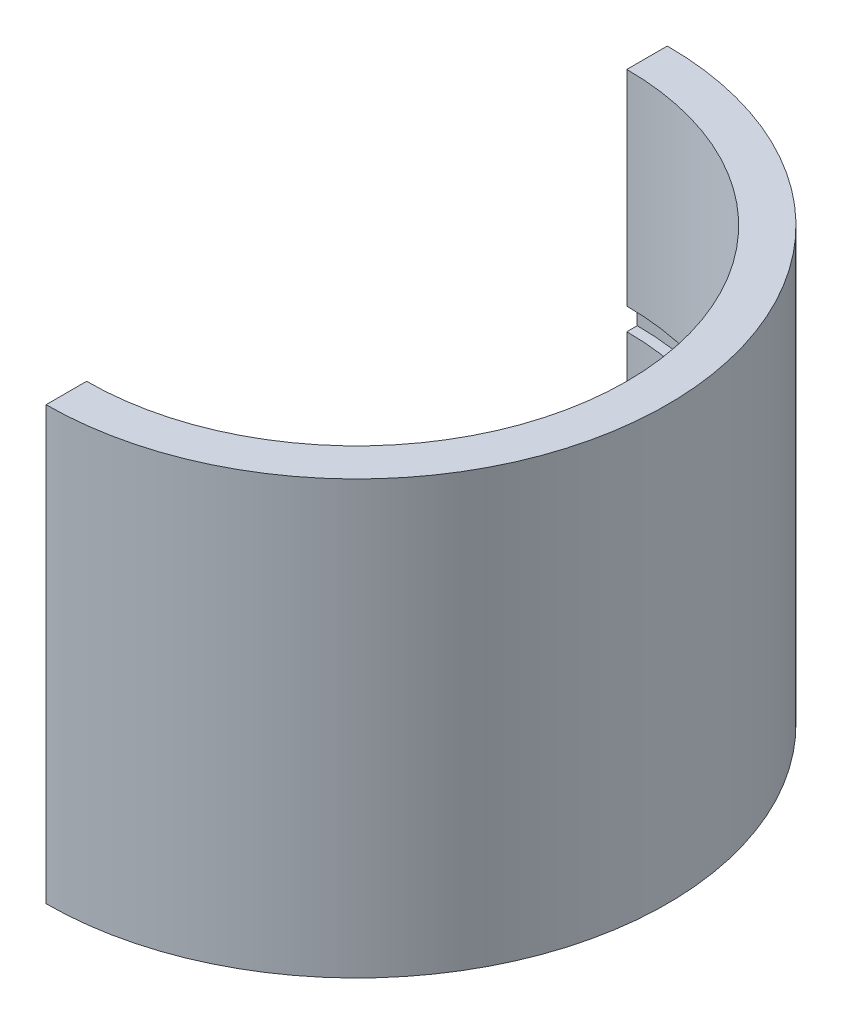
ISO-10303-21;
HEADER;
FILE_DESCRIPTION(('STEP AP214'),'2;1');
FILE_NAME('part.step','',(''),(''),'','','');
FILE_SCHEMA(('AUTOMOTIVE_DESIGN { 1 0 10303 214 1 1 1 1 }'));
ENDSEC;
DATA;
#1=APPLICATION_CONTEXT('core data for automotive mechanical design processes');
#2=APPLICATION_PROTOCOL_DEFINITION('international standard','automotive_design',2000,#1);
#3=PRODUCT_CONTEXT('',#1,'mechanical');
#4=PRODUCT('Part','Part','',(#3));
#5=PRODUCT_RELATED_PRODUCT_CATEGORY('part','',(#4));
#6=PRODUCT_DEFINITION_FORMATION('','',#4);
#7=PRODUCT_DEFINITION_CONTEXT('part definition',#1,'design');
#8=PRODUCT_DEFINITION('design','',#6,#7);
#9=PRODUCT_DEFINITION_SHAPE('','',#8);
#10=(LENGTH_UNIT() NAMED_UNIT(*) SI_UNIT(.MILLI.,.METRE.));
#11=(NAMED_UNIT(*) PLANE_ANGLE_UNIT() SI_UNIT($,.RADIAN.));
#12=(NAMED_UNIT(*) SI_UNIT($,.STERADIAN.) SOLID_ANGLE_UNIT());
#13=UNCERTAINTY_MEASURE_WITH_UNIT(LENGTH_MEASURE(1.E-05),#10,'distance_accuracy_value','');
#14=(GEOMETRIC_REPRESENTATION_CONTEXT(3) GLOBAL_UNCERTAINTY_ASSIGNED_CONTEXT((#13)) GLOBAL_UNIT_ASSIGNED_CONTEXT((#10,
#11,#12)) REPRESENTATION_CONTEXT('',''));
#15=CARTESIAN_POINT('',(0.,0.,0.));
#16=DIRECTION('',(0.,0.,1.));
#17=DIRECTION('',(1.,0.,0.));
#18=AXIS2_PLACEMENT_3D('',#15,#16,#17);
#19=CARTESIAN_POINT('',(0.,19.,0.));
#20=DIRECTION('',(-1.,0.,0.));
#21=DIRECTION('',(0.,0.,1.));
#22=AXIS2_PLACEMENT_3D('',#19,#20,#21);
#23=PLANE('',#22);
#24=DIRECTION('',(0.,-1.,0.));
#25=VECTOR('',#24,1.);
#26=CARTESIAN_POINT('',(0.,19.,11.5));
#27=LINE('',#26,#25);
#28=CARTESIAN_POINT('',(0.,17.5,11.5));
#29=VERTEX_POINT('',#28);
#30=CARTESIAN_POINT('',(0.,1.5,11.5));
#31=VERTEX_POINT('',#30);
#32=EDGE_CURVE('E124',#29,#31,#27,.T.);
#33=ORIENTED_EDGE('',*,*,#32,.F.);
#34=DIRECTION('',(0.,0.,1.));
#35=VECTOR('',#34,1.);
#36=CARTESIAN_POINT('',(0.,17.5,10.));
#37=LINE('',#36,#35);
#38=CARTESIAN_POINT('',(0.,17.5,10.));
#39=VERTEX_POINT('',#38);
#40=EDGE_CURVE('E113',#39,#29,#37,.T.);
#41=ORIENTED_EDGE('',*,*,#40,.F.);
#42=DIRECTION('',(0.,-1.,0.));
#43=VECTOR('',#42,1.);
#44=CARTESIAN_POINT('',(0.,19.,10.));
#45=LINE('',#44,#43);
#46=CARTESIAN_POINT('',(0.,9.90994728555532,10.));
#47=VERTEX_POINT('',#46);
#48=EDGE_CURVE('E48',#39,#47,#45,.T.);
#49=ORIENTED_EDGE('',*,*,#48,.T.);
#50=DIRECTION('',(0.,0.,1.));
#51=VECTOR('',#50,1.);
#52=CARTESIAN_POINT('',(0.,9.90994728555532,0.));
#53=LINE('',#52,#51);
#54=CARTESIAN_POINT('',(0.,9.90994728555532,10.385));
#55=VERTEX_POINT('',#54);
#56=EDGE_CURVE('E133',#47,#55,#53,.T.);
#57=ORIENTED_EDGE('',*,*,#56,.T.);
#58=DIRECTION('',(0.,-1.,0.));
#59=VECTOR('',#58,1.);
#60=CARTESIAN_POINT('',(0.,-0.799894571110644,10.385));
#61=LINE('',#60,#59);
#62=CARTESIAN_POINT('',(0.,9.09005271444468,10.385));
#63=VERTEX_POINT('',#62);
#64=EDGE_CURVE('E156',#63,#55,#61,.F.);
#65=ORIENTED_EDGE('',*,*,#64,.F.);
#66=DIRECTION('',(0.,0.,1.));
#67=VECTOR('',#66,1.);
#68=CARTESIAN_POINT('',(0.,9.09005271444468,0.));
#69=LINE('',#68,#67);
#70=CARTESIAN_POINT('',(0.,9.09005271444468,10.));
#71=VERTEX_POINT('',#70);
#72=EDGE_CURVE('E160',#71,#63,#69,.T.);
#73=ORIENTED_EDGE('',*,*,#72,.F.);
#74=CARTESIAN_POINT('',(0.,1.5,10.));
#75=VERTEX_POINT('',#74);
#76=EDGE_CURVE('E134',#71,#75,#45,.T.);
#77=ORIENTED_EDGE('',*,*,#76,.T.);
#78=DIRECTION('',(0.,0.,-1.));
#79=VECTOR('',#78,1.);
#80=CARTESIAN_POINT('',(0.,1.5,11.5));
#81=LINE('',#80,#79);
#82=EDGE_CURVE('E70',#31,#75,#81,.T.);
#83=ORIENTED_EDGE('',*,*,#82,.F.);
#84=EDGE_LOOP('',(#33,#41,#49,#57,#65,#73,#77,#83));
#85=FACE_BOUND('',#84,.T.);
#86=ADVANCED_FACE('F45',(#85),#23,.T.);
#87=CARTESIAN_POINT('',(0.,19.,0.));
#88=DIRECTION('',(0.,-1.,0.));
#89=DIRECTION('',(0.,0.,-1.));
#90=AXIS2_PLACEMENT_3D('',#87,#88,#89);
#91=CYLINDRICAL_SURFACE('',#90,11.5);
#92=CARTESIAN_POINT('',(0.,17.5,0.));
#93=DIRECTION('',(0.,1.,0.));
#94=DIRECTION('',(0.,0.,1.));
#95=AXIS2_PLACEMENT_3D('',#92,#93,#94);
#96=CIRCLE('',#95,11.5);
#97=CARTESIAN_POINT('',(0.,17.5,-11.5));
#98=VERTEX_POINT('',#97);
#99=EDGE_CURVE('E126',#29,#98,#96,.T.);
#100=ORIENTED_EDGE('',*,*,#99,.F.);
#101=ORIENTED_EDGE('',*,*,#32,.T.);
#102=CARTESIAN_POINT('',(0.,1.5,0.));
#103=DIRECTION('',(0.,-1.,0.));
#104=DIRECTION('',(0.,0.,-1.));
#105=AXIS2_PLACEMENT_3D('',#102,#103,#104);
#106=CIRCLE('',#105,11.5);
#107=CARTESIAN_POINT('',(0.,1.5,-11.5));
#108=VERTEX_POINT('',#107);
#109=EDGE_CURVE('E187',#108,#31,#106,.T.);
#110=ORIENTED_EDGE('',*,*,#109,.F.);
#111=DIRECTION('',(0.,-1.,0.));
#112=VECTOR('',#111,1.);
#113=CARTESIAN_POINT('',(0.,19.,-11.5));
#114=LINE('',#113,#112);
#115=EDGE_CURVE('E153',#98,#108,#114,.T.);
#116=ORIENTED_EDGE('',*,*,#115,.F.);
#117=EDGE_LOOP('',(#100,#101,#110,#116));
#118=FACE_BOUND('',#117,.T.);
#119=ADVANCED_FACE('F199',(#118),#91,.T.);
#120=DIRECTION('',(0.,-1.,0.));
#121=VECTOR('',#120,1.);
#122=CARTESIAN_POINT('',(0.,19.,-10.));
#123=LINE('',#122,#121);
#124=CARTESIAN_POINT('',(0.,17.5,-10.));
#125=VERTEX_POINT('',#124);
#126=CARTESIAN_POINT('',(0.,9.90994728555532,-10.));
#127=VERTEX_POINT('',#126);
#128=EDGE_CURVE('E142',#125,#127,#123,.T.);
#129=ORIENTED_EDGE('',*,*,#128,.F.);
#130=DIRECTION('',(0.,0.,1.));
#131=VECTOR('',#130,1.);
#132=CARTESIAN_POINT('',(0.,17.5,-11.5));
#133=LINE('',#132,#131);
#134=EDGE_CURVE('E62',#98,#125,#133,.T.);
#135=ORIENTED_EDGE('',*,*,#134,.F.);
#136=ORIENTED_EDGE('',*,*,#115,.T.);
#137=DIRECTION('',(0.,0.,-1.));
#138=VECTOR('',#137,1.);
#139=CARTESIAN_POINT('',(0.,1.5,-10.));
#140=LINE('',#139,#138);
#141=CARTESIAN_POINT('',(0.,1.5,-10.));
#142=VERTEX_POINT('',#141);
#143=EDGE_CURVE('E145',#142,#108,#140,.T.);
#144=ORIENTED_EDGE('',*,*,#143,.F.);
#145=CARTESIAN_POINT('',(0.,9.09005271444468,-10.));
#146=VERTEX_POINT('',#145);
#147=EDGE_CURVE('E146',#146,#142,#123,.T.);
#148=ORIENTED_EDGE('',*,*,#147,.F.);
#149=DIRECTION('',(0.,0.,1.));
#150=VECTOR('',#149,1.);
#151=CARTESIAN_POINT('',(0.,9.09005271444468,0.));
#152=LINE('',#151,#150);
#153=CARTESIAN_POINT('',(0.,9.09005271444468,-10.385));
#154=VERTEX_POINT('',#153);
#155=EDGE_CURVE('E163',#154,#146,#152,.T.);
#156=ORIENTED_EDGE('',*,*,#155,.F.);
#157=DIRECTION('',(0.,-1.,0.));
#158=VECTOR('',#157,1.);
#159=CARTESIAN_POINT('',(0.,-0.799894571110644,-10.385));
#160=LINE('',#159,#158);
#161=CARTESIAN_POINT('',(0.,9.90994728555532,-10.385));
#162=VERTEX_POINT('',#161);
#163=EDGE_CURVE('E159',#162,#154,#160,.T.);
#164=ORIENTED_EDGE('',*,*,#163,.F.);
#165=DIRECTION('',(0.,0.,1.));
#166=VECTOR('',#165,1.);
#167=CARTESIAN_POINT('',(0.,9.90994728555532,0.));
#168=LINE('',#167,#166);
#169=EDGE_CURVE('E152',#162,#127,#168,.T.);
#170=ORIENTED_EDGE('',*,*,#169,.T.);
#171=EDGE_LOOP('',(#129,#135,#136,#144,#148,#156,#164,#170));
#172=FACE_BOUND('',#171,.T.);
#173=ADVANCED_FACE('F196',(#172),#23,.T.);
#174=CARTESIAN_POINT('',(0.,19.,0.));
#175=DIRECTION('',(0.,-1.,0.));
#176=DIRECTION('',(0.,0.,-1.));
#177=AXIS2_PLACEMENT_3D('',#174,#175,#176);
#178=CYLINDRICAL_SURFACE('',#177,10.);
#179=ORIENTED_EDGE('',*,*,#48,.F.);
#180=CARTESIAN_POINT('',(0.,17.5,0.));
#181=DIRECTION('',(0.,-1.,0.));
#182=DIRECTION('',(0.,0.,1.));
#183=AXIS2_PLACEMENT_3D('',#180,#181,#182);
#184=CIRCLE('',#183,10.);
#185=EDGE_CURVE('E110',#125,#39,#184,.T.);
#186=ORIENTED_EDGE('',*,*,#185,.F.);
#187=ORIENTED_EDGE('',*,*,#128,.T.);
#188=CARTESIAN_POINT('',(0.,9.90994728555532,0.));
#189=DIRECTION('',(0.,-1.,0.));
#190=DIRECTION('',(0.,0.,-1.));
#191=AXIS2_PLACEMENT_3D('',#188,#189,#190);
#192=CIRCLE('',#191,10.);
#193=EDGE_CURVE('E131',#127,#47,#192,.T.);
#194=ORIENTED_EDGE('',*,*,#193,.T.);
#195=EDGE_LOOP('',(#179,#186,#187,#194));
#196=FACE_BOUND('',#195,.T.);
#197=ADVANCED_FACE('F129',(#196),#178,.F.);
#198=ORIENTED_EDGE('',*,*,#147,.T.);
#199=CARTESIAN_POINT('',(0.,1.5,0.));
#200=DIRECTION('',(0.,1.,0.));
#201=DIRECTION('',(0.,0.,-1.));
#202=AXIS2_PLACEMENT_3D('',#199,#200,#201);
#203=CIRCLE('',#202,10.);
#204=EDGE_CURVE('E182',#75,#142,#203,.T.);
#205=ORIENTED_EDGE('',*,*,#204,.F.);
#206=ORIENTED_EDGE('',*,*,#76,.F.);
#207=CARTESIAN_POINT('',(0.,9.09005271444468,0.));
#208=DIRECTION('',(0.,-1.,0.));
#209=DIRECTION('',(0.,0.,-1.));
#210=AXIS2_PLACEMENT_3D('',#207,#208,#209);
#211=CIRCLE('',#210,10.);
#212=EDGE_CURVE('E54',#146,#71,#211,.T.);
#213=ORIENTED_EDGE('',*,*,#212,.F.);
#214=EDGE_LOOP('',(#198,#205,#206,#213));
#215=FACE_BOUND('',#214,.T.);
#216=ADVANCED_FACE('F206',(#215),#178,.F.);
#217=CARTESIAN_POINT('',(0.,-0.799894571110644,0.));
#218=DIRECTION('',(0.,-1.,0.));
#219=DIRECTION('',(0.,0.,-1.));
#220=AXIS2_PLACEMENT_3D('',#217,#218,#219);
#221=CYLINDRICAL_SURFACE('',#220,10.385);
#222=ORIENTED_EDGE('',*,*,#64,.T.);
#223=CARTESIAN_POINT('',(0.,9.90994728555532,0.));
#224=DIRECTION('',(0.,-1.,0.));
#225=DIRECTION('',(0.,0.,-1.));
#226=AXIS2_PLACEMENT_3D('',#223,#224,#225);
#227=CIRCLE('',#226,10.385);
#228=EDGE_CURVE('E11',#162,#55,#227,.T.);
#229=ORIENTED_EDGE('',*,*,#228,.F.);
#230=ORIENTED_EDGE('',*,*,#163,.T.);
#231=CARTESIAN_POINT('',(0.,9.09005271444468,0.));
#232=DIRECTION('',(0.,-1.,0.));
#233=DIRECTION('',(0.,0.,-1.));
#234=AXIS2_PLACEMENT_3D('',#231,#232,#233);
#235=CIRCLE('',#234,10.385);
#236=EDGE_CURVE('E164',#154,#63,#235,.T.);
#237=ORIENTED_EDGE('',*,*,#236,.T.);
#238=EDGE_LOOP('',(#222,#229,#230,#237));
#239=FACE_BOUND('',#238,.T.);
#240=ADVANCED_FACE('F211',(#239),#221,.F.);
#241=CARTESIAN_POINT('',(0.,9.09005271444468,0.));
#242=DIRECTION('',(0.,-1.,0.));
#243=DIRECTION('',(0.,0.,-1.));
#244=AXIS2_PLACEMENT_3D('',#241,#242,#243);
#245=PLANE('',#244);
#246=ORIENTED_EDGE('',*,*,#72,.T.);
#247=ORIENTED_EDGE('',*,*,#236,.F.);
#248=ORIENTED_EDGE('',*,*,#155,.T.);
#249=ORIENTED_EDGE('',*,*,#212,.T.);
#250=EDGE_LOOP('',(#246,#247,#248,#249));
#251=FACE_BOUND('',#250,.T.);
#252=ADVANCED_FACE('F210',(#251),#245,.F.);
#253=CARTESIAN_POINT('',(0.,9.90994728555532,0.));
#254=DIRECTION('',(0.,-1.,0.));
#255=DIRECTION('',(0.,0.,-1.));
#256=AXIS2_PLACEMENT_3D('',#253,#254,#255);
#257=PLANE('',#256);
#258=ORIENTED_EDGE('',*,*,#193,.F.);
#259=ORIENTED_EDGE('',*,*,#169,.F.);
#260=ORIENTED_EDGE('',*,*,#228,.T.);
#261=ORIENTED_EDGE('',*,*,#56,.F.);
#262=EDGE_LOOP('',(#258,#259,#260,#261));
#263=FACE_BOUND('',#262,.T.);
#264=ADVANCED_FACE('F213',(#263),#257,.T.);
#265=CARTESIAN_POINT('',(0.,1.5,0.));
#266=DIRECTION('',(0.,-1.,0.));
#267=DIRECTION('',(0.,0.,-1.));
#268=AXIS2_PLACEMENT_3D('',#265,#266,#267);
#269=PLANE('',#268);
#270=ORIENTED_EDGE('',*,*,#109,.T.);
#271=ORIENTED_EDGE('',*,*,#82,.T.);
#272=ORIENTED_EDGE('',*,*,#204,.T.);
#273=ORIENTED_EDGE('',*,*,#143,.T.);
#274=EDGE_LOOP('',(#270,#271,#272,#273));
#275=FACE_BOUND('',#274,.T.);
#276=ADVANCED_FACE('F200',(#275),#269,.T.);
#277=CARTESIAN_POINT('',(0.,17.5,0.));
#278=DIRECTION('',(0.,1.,0.));
#279=DIRECTION('',(0.,0.,1.));
#280=AXIS2_PLACEMENT_3D('',#277,#278,#279);
#281=PLANE('',#280);
#282=ORIENTED_EDGE('',*,*,#185,.T.);
#283=ORIENTED_EDGE('',*,*,#40,.T.);
#284=ORIENTED_EDGE('',*,*,#99,.T.);
#285=ORIENTED_EDGE('',*,*,#134,.T.);
#286=EDGE_LOOP('',(#282,#283,#284,#285));
#287=FACE_BOUND('',#286,.T.);
#288=ADVANCED_FACE('F112',(#287),#281,.T.);
#289=CLOSED_SHELL('',(#86,#119,#173,#197,#216,#240,#252,#264,#276,#288));
#290=MANIFOLD_SOLID_BREP('B2',#289);
#291=ADVANCED_BREP_SHAPE_REPRESENTATION('',(#18,#290),#14);
#292=SHAPE_DEFINITION_REPRESENTATION(#9,#291);
ENDSEC;
END-ISO-10303-21;
